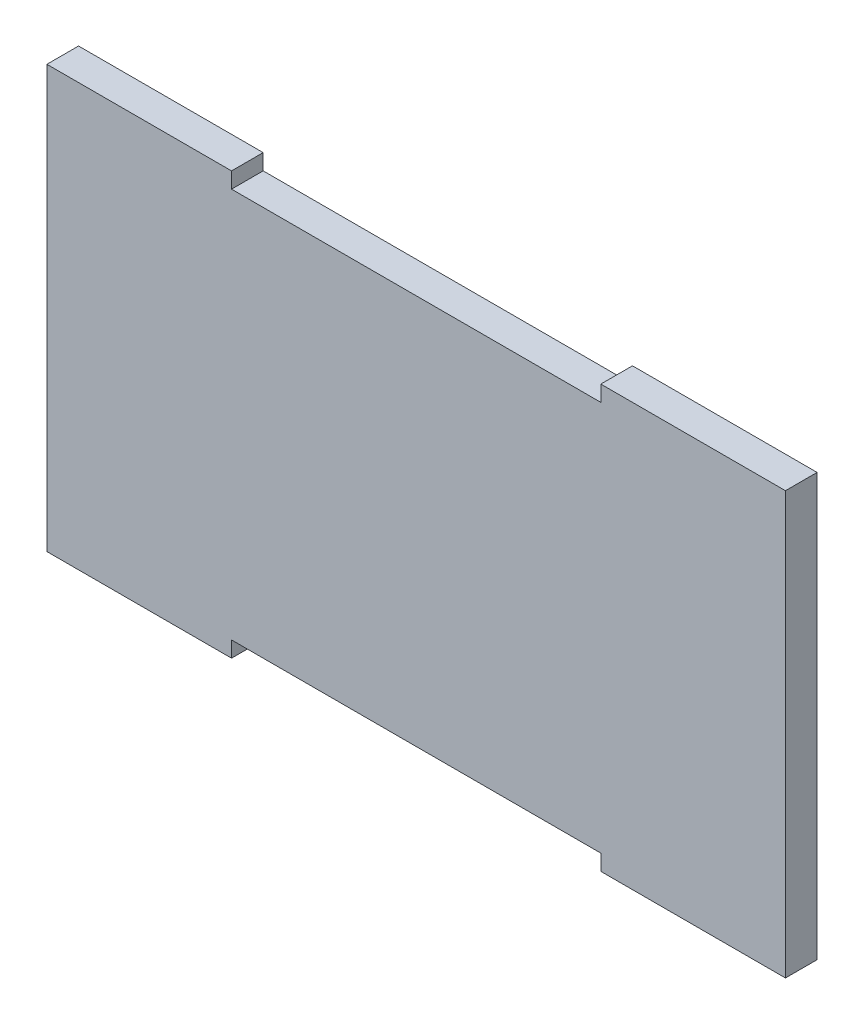
ISO-10303-21;
HEADER;
FILE_DESCRIPTION(('STEP AP214'),'2;1');
FILE_NAME('part.step','',(''),(''),'','','');
FILE_SCHEMA(('AUTOMOTIVE_DESIGN { 1 0 10303 214 1 1 1 1 }'));
ENDSEC;
DATA;
#1=APPLICATION_CONTEXT('core data for automotive mechanical design processes');
#2=APPLICATION_PROTOCOL_DEFINITION('international standard','automotive_design',2000,#1);
#3=PRODUCT_CONTEXT('',#1,'mechanical');
#4=PRODUCT('Part','Part','',(#3));
#5=PRODUCT_RELATED_PRODUCT_CATEGORY('part','',(#4));
#6=PRODUCT_DEFINITION_FORMATION('','',#4);
#7=PRODUCT_DEFINITION_CONTEXT('part definition',#1,'design');
#8=PRODUCT_DEFINITION('design','',#6,#7);
#9=PRODUCT_DEFINITION_SHAPE('','',#8);
#10=(LENGTH_UNIT() NAMED_UNIT(*) SI_UNIT(.MILLI.,.METRE.));
#11=(NAMED_UNIT(*) PLANE_ANGLE_UNIT() SI_UNIT($,.RADIAN.));
#12=(NAMED_UNIT(*) SI_UNIT($,.STERADIAN.) SOLID_ANGLE_UNIT());
#13=UNCERTAINTY_MEASURE_WITH_UNIT(LENGTH_MEASURE(1.E-05),#10,'distance_accuracy_value','');
#14=(GEOMETRIC_REPRESENTATION_CONTEXT(3) GLOBAL_UNCERTAINTY_ASSIGNED_CONTEXT((#13)) GLOBAL_UNIT_ASSIGNED_CONTEXT((#10,
#11,#12)) REPRESENTATION_CONTEXT('',''));
#15=CARTESIAN_POINT('',(0.,0.,0.));
#16=DIRECTION('',(0.,0.,1.));
#17=DIRECTION('',(1.,0.,0.));
#18=AXIS2_PLACEMENT_3D('',#15,#16,#17);
#19=CARTESIAN_POINT('',(-35.,37.,6.));
#20=DIRECTION('',(-1.,0.,0.));
#21=DIRECTION('',(0.,0.,1.));
#22=AXIS2_PLACEMENT_3D('',#19,#20,#21);
#23=PLANE('',#22);
#24=DIRECTION('',(0.,1.,0.));
#25=VECTOR('',#24,1.);
#26=CARTESIAN_POINT('',(-35.,37.,0.));
#27=LINE('',#26,#25);
#28=CARTESIAN_POINT('',(-35.,37.,0.));
#29=VERTEX_POINT('',#28);
#30=CARTESIAN_POINT('',(-35.,40.,0.));
#31=VERTEX_POINT('',#30);
#32=EDGE_CURVE('E166',#29,#31,#27,.T.);
#33=ORIENTED_EDGE('',*,*,#32,.T.);
#34=DIRECTION('',(0.,0.,-1.));
#35=VECTOR('',#34,1.);
#36=CARTESIAN_POINT('',(-35.,40.,6.));
#37=LINE('',#36,#35);
#38=CARTESIAN_POINT('',(-35.,40.,6.));
#39=VERTEX_POINT('',#38);
#40=EDGE_CURVE('E11',#39,#31,#37,.T.);
#41=ORIENTED_EDGE('',*,*,#40,.F.);
#42=DIRECTION('',(0.,1.,0.));
#43=VECTOR('',#42,1.);
#44=CARTESIAN_POINT('',(-35.,37.,6.));
#45=LINE('',#44,#43);
#46=CARTESIAN_POINT('',(-35.,37.,6.));
#47=VERTEX_POINT('',#46);
#48=EDGE_CURVE('E209',#47,#39,#45,.T.);
#49=ORIENTED_EDGE('',*,*,#48,.F.);
#50=DIRECTION('',(0.,0.,-1.));
#51=VECTOR('',#50,1.);
#52=CARTESIAN_POINT('',(-35.,37.,6.));
#53=LINE('',#52,#51);
#54=EDGE_CURVE('E56',#47,#29,#53,.T.);
#55=ORIENTED_EDGE('',*,*,#54,.T.);
#56=EDGE_LOOP('',(#33,#41,#49,#55));
#57=FACE_BOUND('',#56,.T.);
#58=ADVANCED_FACE('F39',(#57),#23,.F.);
#59=CARTESIAN_POINT('',(-35.,40.,6.));
#60=DIRECTION('',(0.,-1.,0.));
#61=DIRECTION('',(0.,0.,-1.));
#62=AXIS2_PLACEMENT_3D('',#59,#60,#61);
#63=PLANE('',#62);
#64=DIRECTION('',(-1.,0.,0.));
#65=VECTOR('',#64,1.);
#66=CARTESIAN_POINT('',(-35.,40.,0.));
#67=LINE('',#66,#65);
#68=CARTESIAN_POINT('',(-70.,40.,0.));
#69=VERTEX_POINT('',#68);
#70=EDGE_CURVE('E169',#31,#69,#67,.T.);
#71=ORIENTED_EDGE('',*,*,#70,.T.);
#72=DIRECTION('',(0.,0.,-1.));
#73=VECTOR('',#72,1.);
#74=CARTESIAN_POINT('',(-70.,40.,6.));
#75=LINE('',#74,#73);
#76=CARTESIAN_POINT('',(-70.,40.,6.));
#77=VERTEX_POINT('',#76);
#78=EDGE_CURVE('E48',#77,#69,#75,.T.);
#79=ORIENTED_EDGE('',*,*,#78,.F.);
#80=DIRECTION('',(-1.,0.,0.));
#81=VECTOR('',#80,1.);
#82=CARTESIAN_POINT('',(-35.,40.,6.));
#83=LINE('',#82,#81);
#84=EDGE_CURVE('E107',#39,#77,#83,.T.);
#85=ORIENTED_EDGE('',*,*,#84,.F.);
#86=ORIENTED_EDGE('',*,*,#40,.T.);
#87=EDGE_LOOP('',(#71,#79,#85,#86));
#88=FACE_BOUND('',#87,.T.);
#89=ADVANCED_FACE('F240',(#88),#63,.F.);
#90=CARTESIAN_POINT('',(-70.,-40.,6.));
#91=DIRECTION('',(-1.,0.,0.));
#92=DIRECTION('',(0.,0.,1.));
#93=AXIS2_PLACEMENT_3D('',#90,#91,#92);
#94=PLANE('',#93);
#95=DIRECTION('',(0.,1.,0.));
#96=VECTOR('',#95,1.);
#97=CARTESIAN_POINT('',(-70.,-40.,0.));
#98=LINE('',#97,#96);
#99=CARTESIAN_POINT('',(-70.,-40.,0.));
#100=VERTEX_POINT('',#99);
#101=EDGE_CURVE('E173',#100,#69,#98,.T.);
#102=ORIENTED_EDGE('',*,*,#101,.F.);
#103=DIRECTION('',(0.,0.,-1.));
#104=VECTOR('',#103,1.);
#105=CARTESIAN_POINT('',(-70.,-40.,6.));
#106=LINE('',#105,#104);
#107=CARTESIAN_POINT('',(-70.,-40.,6.));
#108=VERTEX_POINT('',#107);
#109=EDGE_CURVE('E231',#108,#100,#106,.T.);
#110=ORIENTED_EDGE('',*,*,#109,.F.);
#111=DIRECTION('',(0.,1.,0.));
#112=VECTOR('',#111,1.);
#113=CARTESIAN_POINT('',(-70.,-40.,6.));
#114=LINE('',#113,#112);
#115=EDGE_CURVE('E239',#108,#77,#114,.T.);
#116=ORIENTED_EDGE('',*,*,#115,.T.);
#117=ORIENTED_EDGE('',*,*,#78,.T.);
#118=EDGE_LOOP('',(#102,#110,#116,#117));
#119=FACE_BOUND('',#118,.T.);
#120=ADVANCED_FACE('F237',(#119),#94,.T.);
#121=CARTESIAN_POINT('',(-35.,-40.,6.));
#122=DIRECTION('',(0.,-1.,0.));
#123=DIRECTION('',(0.,0.,-1.));
#124=AXIS2_PLACEMENT_3D('',#121,#122,#123);
#125=PLANE('',#124);
#126=DIRECTION('',(-1.,0.,0.));
#127=VECTOR('',#126,1.);
#128=CARTESIAN_POINT('',(-35.,-40.,0.));
#129=LINE('',#128,#127);
#130=CARTESIAN_POINT('',(-35.,-40.,0.));
#131=VERTEX_POINT('',#130);
#132=EDGE_CURVE('E177',#131,#100,#129,.T.);
#133=ORIENTED_EDGE('',*,*,#132,.F.);
#134=DIRECTION('',(0.,0.,-1.));
#135=VECTOR('',#134,1.);
#136=CARTESIAN_POINT('',(-35.,-40.,6.));
#137=LINE('',#136,#135);
#138=CARTESIAN_POINT('',(-35.,-40.,6.));
#139=VERTEX_POINT('',#138);
#140=EDGE_CURVE('E228',#139,#131,#137,.T.);
#141=ORIENTED_EDGE('',*,*,#140,.F.);
#142=DIRECTION('',(-1.,0.,0.));
#143=VECTOR('',#142,1.);
#144=CARTESIAN_POINT('',(-35.,-40.,6.));
#145=LINE('',#144,#143);
#146=EDGE_CURVE('E251',#139,#108,#145,.T.);
#147=ORIENTED_EDGE('',*,*,#146,.T.);
#148=ORIENTED_EDGE('',*,*,#109,.T.);
#149=EDGE_LOOP('',(#133,#141,#147,#148));
#150=FACE_BOUND('',#149,.T.);
#151=ADVANCED_FACE('F248',(#150),#125,.T.);
#152=CARTESIAN_POINT('',(-35.,-37.,6.));
#153=DIRECTION('',(1.,0.,0.));
#154=DIRECTION('',(0.,1.,0.));
#155=AXIS2_PLACEMENT_3D('',#152,#153,#154);
#156=PLANE('',#155);
#157=DIRECTION('',(0.,-1.,0.));
#158=VECTOR('',#157,1.);
#159=CARTESIAN_POINT('',(-35.,-37.,0.));
#160=LINE('',#159,#158);
#161=CARTESIAN_POINT('',(-35.,-37.,0.));
#162=VERTEX_POINT('',#161);
#163=EDGE_CURVE('E181',#162,#131,#160,.T.);
#164=ORIENTED_EDGE('',*,*,#163,.F.);
#165=DIRECTION('',(0.,0.,-1.));
#166=VECTOR('',#165,1.);
#167=CARTESIAN_POINT('',(-35.,-37.,6.));
#168=LINE('',#167,#166);
#169=CARTESIAN_POINT('',(-35.,-37.,6.));
#170=VERTEX_POINT('',#169);
#171=EDGE_CURVE('E225',#170,#162,#168,.T.);
#172=ORIENTED_EDGE('',*,*,#171,.F.);
#173=DIRECTION('',(0.,-1.,0.));
#174=VECTOR('',#173,1.);
#175=CARTESIAN_POINT('',(-35.,-37.,6.));
#176=LINE('',#175,#174);
#177=EDGE_CURVE('E258',#170,#139,#176,.T.);
#178=ORIENTED_EDGE('',*,*,#177,.T.);
#179=ORIENTED_EDGE('',*,*,#140,.T.);
#180=EDGE_LOOP('',(#164,#172,#178,#179));
#181=FACE_BOUND('',#180,.T.);
#182=ADVANCED_FACE('F361',(#181),#156,.T.);
#183=CARTESIAN_POINT('',(-35.,-37.,6.));
#184=DIRECTION('',(0.,1.,0.));
#185=DIRECTION('',(-1.,0.,0.));
#186=AXIS2_PLACEMENT_3D('',#183,#184,#185);
#187=PLANE('',#186);
#188=DIRECTION('',(1.,0.,0.));
#189=VECTOR('',#188,1.);
#190=CARTESIAN_POINT('',(-35.,-37.,0.));
#191=LINE('',#190,#189);
#192=CARTESIAN_POINT('',(35.,-37.,0.));
#193=VERTEX_POINT('',#192);
#194=EDGE_CURVE('E185',#162,#193,#191,.T.);
#195=ORIENTED_EDGE('',*,*,#194,.T.);
#196=DIRECTION('',(0.,0.,-1.));
#197=VECTOR('',#196,1.);
#198=CARTESIAN_POINT('',(35.,-37.,6.));
#199=LINE('',#198,#197);
#200=CARTESIAN_POINT('',(35.,-37.,6.));
#201=VERTEX_POINT('',#200);
#202=EDGE_CURVE('E222',#201,#193,#199,.T.);
#203=ORIENTED_EDGE('',*,*,#202,.F.);
#204=DIRECTION('',(1.,0.,0.));
#205=VECTOR('',#204,1.);
#206=CARTESIAN_POINT('',(-35.,-37.,6.));
#207=LINE('',#206,#205);
#208=EDGE_CURVE('E265',#170,#201,#207,.T.);
#209=ORIENTED_EDGE('',*,*,#208,.F.);
#210=ORIENTED_EDGE('',*,*,#171,.T.);
#211=EDGE_LOOP('',(#195,#203,#209,#210));
#212=FACE_BOUND('',#211,.T.);
#213=ADVANCED_FACE('F352',(#212),#187,.F.);
#214=CARTESIAN_POINT('',(35.,-40.,6.));
#215=DIRECTION('',(-1.,0.,0.));
#216=DIRECTION('',(0.,-1.,0.));
#217=AXIS2_PLACEMENT_3D('',#214,#215,#216);
#218=PLANE('',#217);
#219=DIRECTION('',(0.,1.,0.));
#220=VECTOR('',#219,1.);
#221=CARTESIAN_POINT('',(35.,-40.,0.));
#222=LINE('',#221,#220);
#223=CARTESIAN_POINT('',(35.,-40.,0.));
#224=VERTEX_POINT('',#223);
#225=EDGE_CURVE('E189',#224,#193,#222,.T.);
#226=ORIENTED_EDGE('',*,*,#225,.F.);
#227=DIRECTION('',(0.,0.,-1.));
#228=VECTOR('',#227,1.);
#229=CARTESIAN_POINT('',(35.,-40.,6.));
#230=LINE('',#229,#228);
#231=CARTESIAN_POINT('',(35.,-40.,6.));
#232=VERTEX_POINT('',#231);
#233=EDGE_CURVE('E219',#232,#224,#230,.T.);
#234=ORIENTED_EDGE('',*,*,#233,.F.);
#235=DIRECTION('',(0.,1.,0.));
#236=VECTOR('',#235,1.);
#237=CARTESIAN_POINT('',(35.,-40.,6.));
#238=LINE('',#237,#236);
#239=EDGE_CURVE('E268',#232,#201,#238,.T.);
#240=ORIENTED_EDGE('',*,*,#239,.T.);
#241=ORIENTED_EDGE('',*,*,#202,.T.);
#242=EDGE_LOOP('',(#226,#234,#240,#241));
#243=FACE_BOUND('',#242,.T.);
#244=ADVANCED_FACE('F284',(#243),#218,.T.);
#245=CARTESIAN_POINT('',(70.,-40.,6.));
#246=DIRECTION('',(0.,-1.,0.));
#247=DIRECTION('',(1.,0.,0.));
#248=AXIS2_PLACEMENT_3D('',#245,#246,#247);
#249=PLANE('',#248);
#250=DIRECTION('',(-1.,0.,0.));
#251=VECTOR('',#250,1.);
#252=CARTESIAN_POINT('',(70.,-40.,0.));
#253=LINE('',#252,#251);
#254=CARTESIAN_POINT('',(70.,-40.,0.));
#255=VERTEX_POINT('',#254);
#256=EDGE_CURVE('E193',#255,#224,#253,.T.);
#257=ORIENTED_EDGE('',*,*,#256,.F.);
#258=DIRECTION('',(0.,0.,-1.));
#259=VECTOR('',#258,1.);
#260=CARTESIAN_POINT('',(70.,-40.,6.));
#261=LINE('',#260,#259);
#262=CARTESIAN_POINT('',(70.,-40.,6.));
#263=VERTEX_POINT('',#262);
#264=EDGE_CURVE('E216',#263,#255,#261,.T.);
#265=ORIENTED_EDGE('',*,*,#264,.F.);
#266=DIRECTION('',(-1.,0.,0.));
#267=VECTOR('',#266,1.);
#268=CARTESIAN_POINT('',(70.,-40.,6.));
#269=LINE('',#268,#267);
#270=EDGE_CURVE('E272',#263,#232,#269,.T.);
#271=ORIENTED_EDGE('',*,*,#270,.T.);
#272=ORIENTED_EDGE('',*,*,#233,.T.);
#273=EDGE_LOOP('',(#257,#265,#271,#272));
#274=FACE_BOUND('',#273,.T.);
#275=ADVANCED_FACE('F278',(#274),#249,.T.);
#276=CARTESIAN_POINT('',(70.,-40.,6.));
#277=DIRECTION('',(-1.,0.,0.));
#278=DIRECTION('',(0.,0.,1.));
#279=AXIS2_PLACEMENT_3D('',#276,#277,#278);
#280=PLANE('',#279);
#281=DIRECTION('',(0.,1.,0.));
#282=VECTOR('',#281,1.);
#283=CARTESIAN_POINT('',(70.,-40.,0.));
#284=LINE('',#283,#282);
#285=CARTESIAN_POINT('',(70.,40.,0.));
#286=VERTEX_POINT('',#285);
#287=EDGE_CURVE('E197',#255,#286,#284,.T.);
#288=ORIENTED_EDGE('',*,*,#287,.T.);
#289=DIRECTION('',(0.,0.,-1.));
#290=VECTOR('',#289,1.);
#291=CARTESIAN_POINT('',(70.,40.,6.));
#292=LINE('',#291,#290);
#293=CARTESIAN_POINT('',(70.,40.,6.));
#294=VERTEX_POINT('',#293);
#295=EDGE_CURVE('E156',#294,#286,#292,.T.);
#296=ORIENTED_EDGE('',*,*,#295,.F.);
#297=DIRECTION('',(0.,1.,0.));
#298=VECTOR('',#297,1.);
#299=CARTESIAN_POINT('',(70.,-40.,6.));
#300=LINE('',#299,#298);
#301=EDGE_CURVE('E142',#263,#294,#300,.T.);
#302=ORIENTED_EDGE('',*,*,#301,.F.);
#303=ORIENTED_EDGE('',*,*,#264,.T.);
#304=EDGE_LOOP('',(#288,#296,#302,#303));
#305=FACE_BOUND('',#304,.T.);
#306=ADVANCED_FACE('F287',(#305),#280,.F.);
#307=CARTESIAN_POINT('',(70.,40.,6.));
#308=DIRECTION('',(0.,-1.,0.));
#309=DIRECTION('',(1.,0.,0.));
#310=AXIS2_PLACEMENT_3D('',#307,#308,#309);
#311=PLANE('',#310);
#312=DIRECTION('',(-1.,0.,0.));
#313=VECTOR('',#312,1.);
#314=CARTESIAN_POINT('',(70.,40.,0.));
#315=LINE('',#314,#313);
#316=CARTESIAN_POINT('',(35.,40.,0.));
#317=VERTEX_POINT('',#316);
#318=EDGE_CURVE('E152',#286,#317,#315,.T.);
#319=ORIENTED_EDGE('',*,*,#318,.T.);
#320=DIRECTION('',(0.,0.,-1.));
#321=VECTOR('',#320,1.);
#322=CARTESIAN_POINT('',(35.,40.,6.));
#323=LINE('',#322,#321);
#324=CARTESIAN_POINT('',(35.,40.,6.));
#325=VERTEX_POINT('',#324);
#326=EDGE_CURVE('E149',#325,#317,#323,.T.);
#327=ORIENTED_EDGE('',*,*,#326,.F.);
#328=DIRECTION('',(-1.,0.,0.));
#329=VECTOR('',#328,1.);
#330=CARTESIAN_POINT('',(70.,40.,6.));
#331=LINE('',#330,#329);
#332=EDGE_CURVE('E134',#294,#325,#331,.T.);
#333=ORIENTED_EDGE('',*,*,#332,.F.);
#334=ORIENTED_EDGE('',*,*,#295,.T.);
#335=EDGE_LOOP('',(#319,#327,#333,#334));
#336=FACE_BOUND('',#335,.T.);
#337=ADVANCED_FACE('F150',(#336),#311,.F.);
#338=CARTESIAN_POINT('',(35.,40.,6.));
#339=DIRECTION('',(1.,0.,0.));
#340=DIRECTION('',(0.,0.,-1.));
#341=AXIS2_PLACEMENT_3D('',#338,#339,#340);
#342=PLANE('',#341);
#343=DIRECTION('',(0.,-1.,0.));
#344=VECTOR('',#343,1.);
#345=CARTESIAN_POINT('',(35.,40.,0.));
#346=LINE('',#345,#344);
#347=CARTESIAN_POINT('',(35.,37.,0.));
#348=VERTEX_POINT('',#347);
#349=EDGE_CURVE('E202',#317,#348,#346,.T.);
#350=ORIENTED_EDGE('',*,*,#349,.T.);
#351=DIRECTION('',(0.,0.,-1.));
#352=VECTOR('',#351,1.);
#353=CARTESIAN_POINT('',(35.,37.,6.));
#354=LINE('',#353,#352);
#355=CARTESIAN_POINT('',(35.,37.,6.));
#356=VERTEX_POINT('',#355);
#357=EDGE_CURVE('E95',#356,#348,#354,.T.);
#358=ORIENTED_EDGE('',*,*,#357,.F.);
#359=DIRECTION('',(0.,-1.,0.));
#360=VECTOR('',#359,1.);
#361=CARTESIAN_POINT('',(35.,40.,6.));
#362=LINE('',#361,#360);
#363=EDGE_CURVE('E139',#325,#356,#362,.T.);
#364=ORIENTED_EDGE('',*,*,#363,.F.);
#365=ORIENTED_EDGE('',*,*,#326,.T.);
#366=EDGE_LOOP('',(#350,#358,#364,#365));
#367=FACE_BOUND('',#366,.T.);
#368=ADVANCED_FACE('F158',(#367),#342,.F.);
#369=CARTESIAN_POINT('',(-35.,37.,6.));
#370=DIRECTION('',(0.,1.,0.));
#371=DIRECTION('',(-1.,0.,0.));
#372=AXIS2_PLACEMENT_3D('',#369,#370,#371);
#373=PLANE('',#372);
#374=DIRECTION('',(1.,0.,0.));
#375=VECTOR('',#374,1.);
#376=CARTESIAN_POINT('',(-35.,37.,0.));
#377=LINE('',#376,#375);
#378=EDGE_CURVE('E205',#29,#348,#377,.T.);
#379=ORIENTED_EDGE('',*,*,#378,.F.);
#380=ORIENTED_EDGE('',*,*,#54,.F.);
#381=DIRECTION('',(1.,0.,0.));
#382=VECTOR('',#381,1.);
#383=CARTESIAN_POINT('',(-35.,37.,6.));
#384=LINE('',#383,#382);
#385=EDGE_CURVE('E160',#47,#356,#384,.T.);
#386=ORIENTED_EDGE('',*,*,#385,.T.);
#387=ORIENTED_EDGE('',*,*,#357,.T.);
#388=EDGE_LOOP('',(#379,#380,#386,#387));
#389=FACE_BOUND('',#388,.T.);
#390=ADVANCED_FACE('F300',(#389),#373,.T.);
#391=CARTESIAN_POINT('',(0.,0.,6.));
#392=DIRECTION('',(0.,0.,1.));
#393=DIRECTION('',(1.,0.,0.));
#394=AXIS2_PLACEMENT_3D('',#391,#392,#393);
#395=PLANE('',#394);
#396=ORIENTED_EDGE('',*,*,#48,.T.);
#397=ORIENTED_EDGE('',*,*,#84,.T.);
#398=ORIENTED_EDGE('',*,*,#115,.F.);
#399=ORIENTED_EDGE('',*,*,#146,.F.);
#400=ORIENTED_EDGE('',*,*,#177,.F.);
#401=ORIENTED_EDGE('',*,*,#208,.T.);
#402=ORIENTED_EDGE('',*,*,#239,.F.);
#403=ORIENTED_EDGE('',*,*,#270,.F.);
#404=ORIENTED_EDGE('',*,*,#301,.T.);
#405=ORIENTED_EDGE('',*,*,#332,.T.);
#406=ORIENTED_EDGE('',*,*,#363,.T.);
#407=ORIENTED_EDGE('',*,*,#385,.F.);
#408=EDGE_LOOP('',(#396,#397,#398,#399,#400,#401,#402,#403,#404,#405,#406,#407));
#409=FACE_BOUND('',#408,.T.);
#410=ADVANCED_FACE('F136',(#409),#395,.T.);
#411=CARTESIAN_POINT('',(0.,0.,0.));
#412=DIRECTION('',(0.,0.,1.));
#413=DIRECTION('',(1.,0.,0.));
#414=AXIS2_PLACEMENT_3D('',#411,#412,#413);
#415=PLANE('',#414);
#416=ORIENTED_EDGE('',*,*,#32,.F.);
#417=ORIENTED_EDGE('',*,*,#378,.T.);
#418=ORIENTED_EDGE('',*,*,#349,.F.);
#419=ORIENTED_EDGE('',*,*,#318,.F.);
#420=ORIENTED_EDGE('',*,*,#287,.F.);
#421=ORIENTED_EDGE('',*,*,#256,.T.);
#422=ORIENTED_EDGE('',*,*,#225,.T.);
#423=ORIENTED_EDGE('',*,*,#194,.F.);
#424=ORIENTED_EDGE('',*,*,#163,.T.);
#425=ORIENTED_EDGE('',*,*,#132,.T.);
#426=ORIENTED_EDGE('',*,*,#101,.T.);
#427=ORIENTED_EDGE('',*,*,#70,.F.);
#428=EDGE_LOOP('',(#416,#417,#418,#419,#420,#421,#422,#423,#424,#425,#426,#427));
#429=FACE_BOUND('',#428,.T.);
#430=ADVANCED_FACE('F243',(#429),#415,.F.);
#431=CLOSED_SHELL('',(#58,#89,#120,#151,#182,#213,#244,#275,#306,#337,#368,#390,#410,#430));
#432=MANIFOLD_SOLID_BREP('B2',#431);
#433=ADVANCED_BREP_SHAPE_REPRESENTATION('',(#18,#432),#14);
#434=SHAPE_DEFINITION_REPRESENTATION(#9,#433);
ENDSEC;
END-ISO-10303-21;
